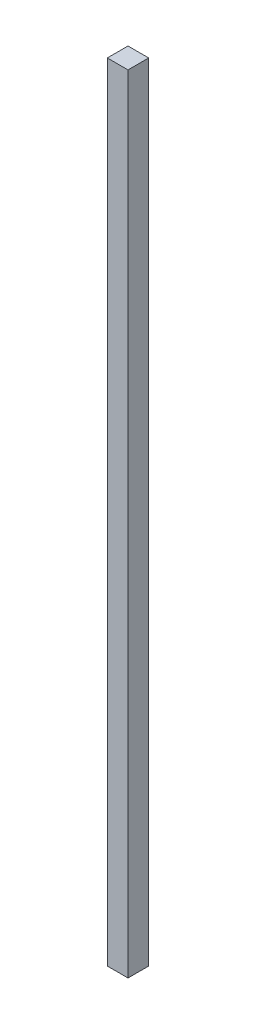
ISO-10303-21;
HEADER;
FILE_DESCRIPTION(('STEP AP214'),'2;1');
FILE_NAME('part.step','',(''),(''),'','','');
FILE_SCHEMA(('AUTOMOTIVE_DESIGN { 1 0 10303 214 1 1 1 1 }'));
ENDSEC;
DATA;
#1=APPLICATION_CONTEXT('core data for automotive mechanical design processes');
#2=APPLICATION_PROTOCOL_DEFINITION('international standard','automotive_design',2000,#1);
#3=PRODUCT_CONTEXT('',#1,'mechanical');
#4=PRODUCT('Part','Part','',(#3));
#5=PRODUCT_RELATED_PRODUCT_CATEGORY('part','',(#4));
#6=PRODUCT_DEFINITION_FORMATION('','',#4);
#7=PRODUCT_DEFINITION_CONTEXT('part definition',#1,'design');
#8=PRODUCT_DEFINITION('design','',#6,#7);
#9=PRODUCT_DEFINITION_SHAPE('','',#8);
#10=(LENGTH_UNIT() NAMED_UNIT(*) SI_UNIT(.MILLI.,.METRE.));
#11=(NAMED_UNIT(*) PLANE_ANGLE_UNIT() SI_UNIT($,.RADIAN.));
#12=(NAMED_UNIT(*) SI_UNIT($,.STERADIAN.) SOLID_ANGLE_UNIT());
#13=UNCERTAINTY_MEASURE_WITH_UNIT(LENGTH_MEASURE(1.E-05),#10,'distance_accuracy_value','');
#14=(GEOMETRIC_REPRESENTATION_CONTEXT(3) GLOBAL_UNCERTAINTY_ASSIGNED_CONTEXT((#13)) GLOBAL_UNIT_ASSIGNED_CONTEXT((#10,
#11,#12)) REPRESENTATION_CONTEXT('',''));
#15=CARTESIAN_POINT('',(0.,0.,0.));
#16=DIRECTION('',(0.,0.,1.));
#17=DIRECTION('',(1.,0.,0.));
#18=AXIS2_PLACEMENT_3D('',#15,#16,#17);
#19=CARTESIAN_POINT('',(-25.,1900.,-25.));
#20=DIRECTION('',(1.,0.,0.));
#21=DIRECTION('',(0.,0.,-1.));
#22=AXIS2_PLACEMENT_3D('',#19,#20,#21);
#23=PLANE('',#22);
#24=DIRECTION('',(0.,0.,1.));
#25=VECTOR('',#24,1.);
#26=CARTESIAN_POINT('',(-25.,0.,-25.));
#27=LINE('',#26,#25);
#28=CARTESIAN_POINT('',(-25.,0.,-25.));
#29=VERTEX_POINT('',#28);
#30=CARTESIAN_POINT('',(-25.,0.,25.));
#31=VERTEX_POINT('',#30);
#32=EDGE_CURVE('E111',#29,#31,#27,.T.);
#33=ORIENTED_EDGE('',*,*,#32,.T.);
#34=DIRECTION('',(0.,-1.,0.));
#35=VECTOR('',#34,1.);
#36=CARTESIAN_POINT('',(-25.,1900.,25.));
#37=LINE('',#36,#35);
#38=CARTESIAN_POINT('',(-25.,1900.,25.));
#39=VERTEX_POINT('',#38);
#40=EDGE_CURVE('E11',#39,#31,#37,.T.);
#41=ORIENTED_EDGE('',*,*,#40,.F.);
#42=DIRECTION('',(0.,0.,1.));
#43=VECTOR('',#42,1.);
#44=CARTESIAN_POINT('',(-25.,1900.,-25.));
#45=LINE('',#44,#43);
#46=CARTESIAN_POINT('',(-25.,1900.,-25.));
#47=VERTEX_POINT('',#46);
#48=EDGE_CURVE('E95',#47,#39,#45,.T.);
#49=ORIENTED_EDGE('',*,*,#48,.F.);
#50=DIRECTION('',(0.,-1.,0.));
#51=VECTOR('',#50,1.);
#52=CARTESIAN_POINT('',(-25.,1900.,-25.));
#53=LINE('',#52,#51);
#54=EDGE_CURVE('E107',#47,#29,#53,.T.);
#55=ORIENTED_EDGE('',*,*,#54,.T.);
#56=EDGE_LOOP('',(#33,#41,#49,#55));
#57=FACE_BOUND('',#56,.T.);
#58=ADVANCED_FACE('F43',(#57),#23,.F.);
#59=CARTESIAN_POINT('',(25.,1900.,25.));
#60=DIRECTION('',(0.,0.,-1.));
#61=DIRECTION('',(-1.,0.,0.));
#62=AXIS2_PLACEMENT_3D('',#59,#60,#61);
#63=PLANE('',#62);
#64=DIRECTION('',(1.,0.,0.));
#65=VECTOR('',#64,1.);
#66=CARTESIAN_POINT('',(25.,0.,25.));
#67=LINE('',#66,#65);
#68=CARTESIAN_POINT('',(25.,0.,25.));
#69=VERTEX_POINT('',#68);
#70=EDGE_CURVE('E100',#31,#69,#67,.T.);
#71=ORIENTED_EDGE('',*,*,#70,.T.);
#72=DIRECTION('',(0.,-1.,0.));
#73=VECTOR('',#72,1.);
#74=CARTESIAN_POINT('',(25.,1900.,25.));
#75=LINE('',#74,#73);
#76=CARTESIAN_POINT('',(25.,1900.,25.));
#77=VERTEX_POINT('',#76);
#78=EDGE_CURVE('E52',#77,#69,#75,.T.);
#79=ORIENTED_EDGE('',*,*,#78,.F.);
#80=DIRECTION('',(1.,0.,0.));
#81=VECTOR('',#80,1.);
#82=CARTESIAN_POINT('',(25.,1900.,25.));
#83=LINE('',#82,#81);
#84=EDGE_CURVE('E90',#39,#77,#83,.T.);
#85=ORIENTED_EDGE('',*,*,#84,.F.);
#86=ORIENTED_EDGE('',*,*,#40,.T.);
#87=EDGE_LOOP('',(#71,#79,#85,#86));
#88=FACE_BOUND('',#87,.T.);
#89=ADVANCED_FACE('F99',(#88),#63,.F.);
#90=CARTESIAN_POINT('',(25.,1900.,-25.));
#91=DIRECTION('',(-1.,0.,0.));
#92=DIRECTION('',(0.,0.,1.));
#93=AXIS2_PLACEMENT_3D('',#90,#91,#92);
#94=PLANE('',#93);
#95=DIRECTION('',(0.,0.,-1.));
#96=VECTOR('',#95,1.);
#97=CARTESIAN_POINT('',(25.,0.,-25.));
#98=LINE('',#97,#96);
#99=CARTESIAN_POINT('',(25.,0.,-25.));
#100=VERTEX_POINT('',#99);
#101=EDGE_CURVE('E77',#69,#100,#98,.T.);
#102=ORIENTED_EDGE('',*,*,#101,.T.);
#103=DIRECTION('',(0.,-1.,0.));
#104=VECTOR('',#103,1.);
#105=CARTESIAN_POINT('',(25.,1900.,-25.));
#106=LINE('',#105,#104);
#107=CARTESIAN_POINT('',(25.,1900.,-25.));
#108=VERTEX_POINT('',#107);
#109=EDGE_CURVE('E102',#108,#100,#106,.T.);
#110=ORIENTED_EDGE('',*,*,#109,.F.);
#111=DIRECTION('',(0.,0.,-1.));
#112=VECTOR('',#111,1.);
#113=CARTESIAN_POINT('',(25.,1900.,-25.));
#114=LINE('',#113,#112);
#115=EDGE_CURVE('E93',#77,#108,#114,.T.);
#116=ORIENTED_EDGE('',*,*,#115,.F.);
#117=ORIENTED_EDGE('',*,*,#78,.T.);
#118=EDGE_LOOP('',(#102,#110,#116,#117));
#119=FACE_BOUND('',#118,.T.);
#120=ADVANCED_FACE('F103',(#119),#94,.F.);
#121=CARTESIAN_POINT('',(25.,1900.,-25.));
#122=DIRECTION('',(0.,0.,1.));
#123=DIRECTION('',(1.,0.,0.));
#124=AXIS2_PLACEMENT_3D('',#121,#122,#123);
#125=PLANE('',#124);
#126=DIRECTION('',(-1.,0.,0.));
#127=VECTOR('',#126,1.);
#128=CARTESIAN_POINT('',(25.,0.,-25.));
#129=LINE('',#128,#127);
#130=EDGE_CURVE('E83',#100,#29,#129,.T.);
#131=ORIENTED_EDGE('',*,*,#130,.T.);
#132=ORIENTED_EDGE('',*,*,#54,.F.);
#133=DIRECTION('',(-1.,0.,0.));
#134=VECTOR('',#133,1.);
#135=CARTESIAN_POINT('',(25.,1900.,-25.));
#136=LINE('',#135,#134);
#137=EDGE_CURVE('E60',#108,#47,#136,.T.);
#138=ORIENTED_EDGE('',*,*,#137,.F.);
#139=ORIENTED_EDGE('',*,*,#109,.T.);
#140=EDGE_LOOP('',(#131,#132,#138,#139));
#141=FACE_BOUND('',#140,.T.);
#142=ADVANCED_FACE('F124',(#141),#125,.F.);
#143=CARTESIAN_POINT('',(0.,1900.,0.));
#144=DIRECTION('',(0.,-1.,0.));
#145=DIRECTION('',(0.,0.,-1.));
#146=AXIS2_PLACEMENT_3D('',#143,#144,#145);
#147=PLANE('',#146);
#148=ORIENTED_EDGE('',*,*,#48,.T.);
#149=ORIENTED_EDGE('',*,*,#84,.T.);
#150=ORIENTED_EDGE('',*,*,#115,.T.);
#151=ORIENTED_EDGE('',*,*,#137,.T.);
#152=EDGE_LOOP('',(#148,#149,#150,#151));
#153=FACE_BOUND('',#152,.T.);
#154=ADVANCED_FACE('F91',(#153),#147,.F.);
#155=CARTESIAN_POINT('',(0.,0.,0.));
#156=DIRECTION('',(0.,-1.,0.));
#157=DIRECTION('',(0.,0.,-1.));
#158=AXIS2_PLACEMENT_3D('',#155,#156,#157);
#159=PLANE('',#158);
#160=ORIENTED_EDGE('',*,*,#32,.F.);
#161=ORIENTED_EDGE('',*,*,#130,.F.);
#162=ORIENTED_EDGE('',*,*,#101,.F.);
#163=ORIENTED_EDGE('',*,*,#70,.F.);
#164=EDGE_LOOP('',(#160,#161,#162,#163));
#165=FACE_BOUND('',#164,.T.);
#166=ADVANCED_FACE('F127',(#165),#159,.T.);
#167=CLOSED_SHELL('',(#58,#89,#120,#142,#154,#166));
#168=MANIFOLD_SOLID_BREP('B2',#167);
#169=ADVANCED_BREP_SHAPE_REPRESENTATION('',(#18,#168),#14);
#170=SHAPE_DEFINITION_REPRESENTATION(#9,#169);
ENDSEC;
END-ISO-10303-21;
